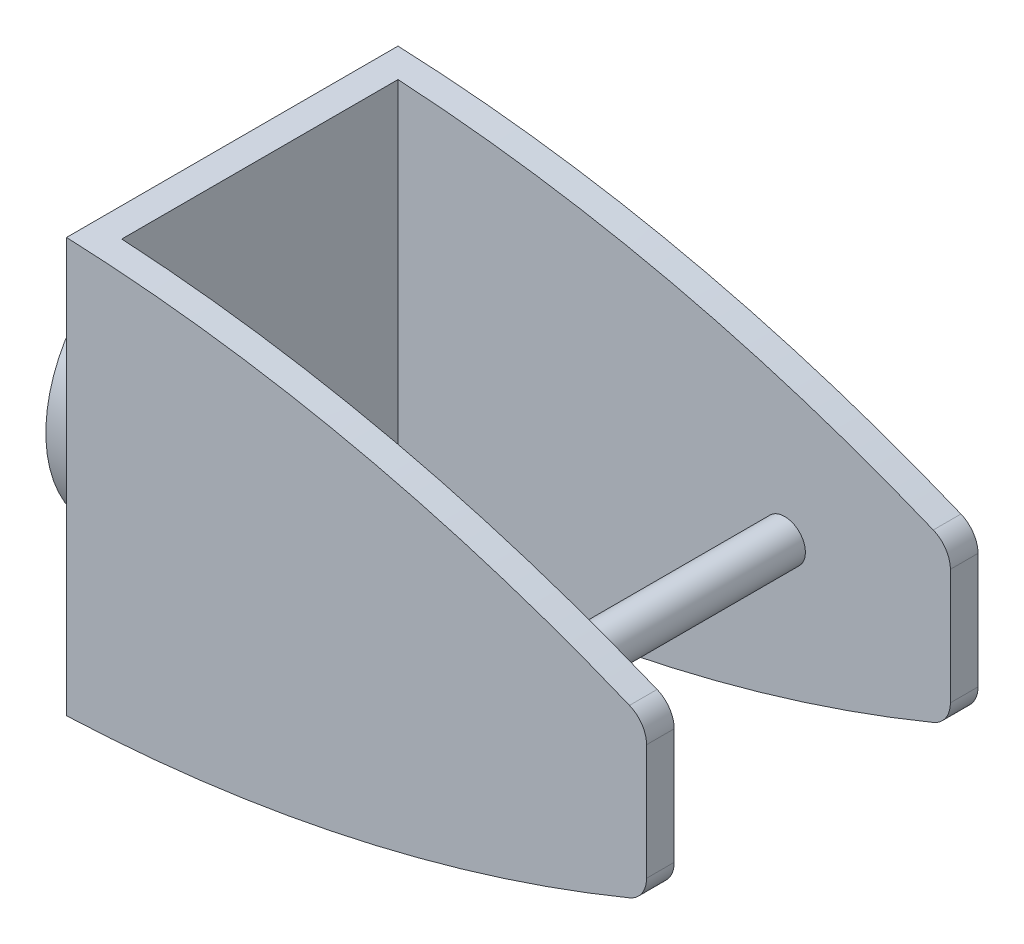
ISO-10303-21;
HEADER;
FILE_DESCRIPTION(('STEP AP214'),'2;1');
FILE_NAME('part.step','',(''),(''),'','','');
FILE_SCHEMA(('AUTOMOTIVE_DESIGN { 1 0 10303 214 1 1 1 1 }'));
ENDSEC;
DATA;
#1=APPLICATION_CONTEXT('core data for automotive mechanical design processes');
#2=APPLICATION_PROTOCOL_DEFINITION('international standard','automotive_design',2000,#1);
#3=PRODUCT_CONTEXT('',#1,'mechanical');
#4=PRODUCT('Part','Part','',(#3));
#5=PRODUCT_RELATED_PRODUCT_CATEGORY('part','',(#4));
#6=PRODUCT_DEFINITION_FORMATION('','',#4);
#7=PRODUCT_DEFINITION_CONTEXT('part definition',#1,'design');
#8=PRODUCT_DEFINITION('design','',#6,#7);
#9=PRODUCT_DEFINITION_SHAPE('','',#8);
#10=(LENGTH_UNIT() NAMED_UNIT(*) SI_UNIT(.MILLI.,.METRE.));
#11=(NAMED_UNIT(*) PLANE_ANGLE_UNIT() SI_UNIT($,.RADIAN.));
#12=(NAMED_UNIT(*) SI_UNIT($,.STERADIAN.) SOLID_ANGLE_UNIT());
#13=UNCERTAINTY_MEASURE_WITH_UNIT(LENGTH_MEASURE(1.E-05),#10,'distance_accuracy_value','');
#14=(GEOMETRIC_REPRESENTATION_CONTEXT(3) GLOBAL_UNCERTAINTY_ASSIGNED_CONTEXT((#13)) GLOBAL_UNIT_ASSIGNED_CONTEXT((#10,
#11,#12)) REPRESENTATION_CONTEXT('',''));
#15=CARTESIAN_POINT('',(0.,0.,0.));
#16=DIRECTION('',(0.,0.,1.));
#17=DIRECTION('',(1.,0.,0.));
#18=AXIS2_PLACEMENT_3D('',#15,#16,#17);
#19=CARTESIAN_POINT('',(5.5,0.,0.));
#20=DIRECTION('',(1.,0.,0.));
#21=DIRECTION('',(0.,0.,-1.));
#22=AXIS2_PLACEMENT_3D('',#19,#20,#21);
#23=PLANE('',#22);
#24=DIRECTION('',(0.,0.,1.));
#25=VECTOR('',#24,1.);
#26=CARTESIAN_POINT('',(5.5,14.8998712709332,-28.));
#27=LINE('',#26,#25);
#28=CARTESIAN_POINT('',(5.5,14.8998712709332,10.));
#29=VERTEX_POINT('',#28);
#30=CARTESIAN_POINT('',(5.5,14.8998712709332,-10.));
#31=VERTEX_POINT('',#30);
#32=EDGE_CURVE('E209',#29,#31,#27,.F.);
#33=ORIENTED_EDGE('',*,*,#32,.F.);
#34=DIRECTION('',(0.,1.,0.));
#35=VECTOR('',#34,1.);
#36=CARTESIAN_POINT('',(5.5,15.,10.));
#37=LINE('',#36,#35);
#38=CARTESIAN_POINT('',(5.5,-14.8998712709332,10.));
#39=VERTEX_POINT('',#38);
#40=EDGE_CURVE('E208',#39,#29,#37,.T.);
#41=ORIENTED_EDGE('',*,*,#40,.F.);
#42=DIRECTION('',(0.,0.,1.));
#43=VECTOR('',#42,1.);
#44=CARTESIAN_POINT('',(5.5,-14.8998712709332,-28.));
#45=LINE('',#44,#43);
#46=CARTESIAN_POINT('',(5.5,-14.8998712709332,-10.));
#47=VERTEX_POINT('',#46);
#48=EDGE_CURVE('E236',#47,#39,#45,.T.);
#49=ORIENTED_EDGE('',*,*,#48,.F.);
#50=DIRECTION('',(0.,-1.,0.));
#51=VECTOR('',#50,1.);
#52=CARTESIAN_POINT('',(5.5,15.,-10.));
#53=LINE('',#52,#51);
#54=EDGE_CURVE('E160',#31,#47,#53,.T.);
#55=ORIENTED_EDGE('',*,*,#54,.F.);
#56=EDGE_LOOP('',(#33,#41,#49,#55));
#57=FACE_BOUND('',#56,.T.);
#58=ADVANCED_FACE('F35',(#57),#23,.T.);
#59=CARTESIAN_POINT('',(3.5,0.,0.));
#60=DIRECTION('',(-1.,0.,0.));
#61=DIRECTION('',(0.,0.,1.));
#62=AXIS2_PLACEMENT_3D('',#59,#60,#61);
#63=CYLINDRICAL_SURFACE('',#62,10.);
#64=CARTESIAN_POINT('',(3.5,0.,0.));
#65=DIRECTION('',(1.,0.,0.));
#66=DIRECTION('',(0.,0.,-1.));
#67=AXIS2_PLACEMENT_3D('',#64,#65,#66);
#68=CIRCLE('',#67,10.);
#69=CARTESIAN_POINT('',(3.5,0.,-10.));
#70=VERTEX_POINT('',#69);
#71=EDGE_CURVE('E163',#70,#70,#68,.T.);
#72=ORIENTED_EDGE('',*,*,#71,.F.);
#73=EDGE_LOOP('',(#72));
#74=FACE_BOUND('',#73,.T.);
#75=CARTESIAN_POINT('',(0.,0.,0.));
#76=DIRECTION('',(1.,0.,0.));
#77=DIRECTION('',(0.,0.,-1.));
#78=AXIS2_PLACEMENT_3D('',#75,#76,#77);
#79=CIRCLE('',#78,10.);
#80=CARTESIAN_POINT('',(0.,0.,-10.));
#81=VERTEX_POINT('',#80);
#82=EDGE_CURVE('E135',#81,#81,#79,.T.);
#83=ORIENTED_EDGE('',*,*,#82,.T.);
#84=EDGE_LOOP('',(#83));
#85=FACE_BOUND('',#84,.T.);
#86=ADVANCED_FACE('F261',(#74,#85),#63,.T.);
#87=CARTESIAN_POINT('',(0.,0.,0.));
#88=DIRECTION('',(1.,0.,0.));
#89=DIRECTION('',(0.,0.,-1.));
#90=AXIS2_PLACEMENT_3D('',#87,#88,#89);
#91=PLANE('',#90);
#92=ORIENTED_EDGE('',*,*,#82,.F.);
#93=EDGE_LOOP('',(#92));
#94=FACE_BOUND('',#93,.T.);
#95=ADVANCED_FACE('F266',(#94),#91,.F.);
#96=CARTESIAN_POINT('',(5.5,15.,12.));
#97=DIRECTION('',(0.,0.,-1.));
#98=DIRECTION('',(0.,1.,0.));
#99=AXIS2_PLACEMENT_3D('',#96,#97,#98);
#100=PLANE('',#99);
#101=CARTESIAN_POINT('',(-1.5,104.895788082818,12.));
#102=DIRECTION('',(0.,0.,-1.));
#103=DIRECTION('',(1.,0.,0.));
#104=AXIS2_PLACEMENT_3D('',#101,#102,#103);
#105=CIRCLE('',#104,120.);
#106=CARTESIAN_POINT('',(44.2627118644068,-6.03560604353059,12.));
#107=VERTEX_POINT('',#106);
#108=CARTESIAN_POINT('',(3.5,-15.,12.));
#109=VERTEX_POINT('',#108);
#110=EDGE_CURVE('E147',#107,#109,#105,.T.);
#111=ORIENTED_EDGE('',*,*,#110,.F.);
#112=CARTESIAN_POINT('',(43.5,-4.18674947475813,12.));
#113=DIRECTION('',(0.,0.,-1.));
#114=DIRECTION('',(0.,1.,0.));
#115=AXIS2_PLACEMENT_3D('',#112,#113,#114);
#116=CIRCLE('',#115,2.);
#117=CARTESIAN_POINT('',(45.5,-4.18674947475813,12.));
#118=VERTEX_POINT('',#117);
#119=EDGE_CURVE('E175',#107,#118,#116,.F.);
#120=ORIENTED_EDGE('',*,*,#119,.T.);
#121=DIRECTION('',(0.,-1.,0.));
#122=VECTOR('',#121,1.);
#123=CARTESIAN_POINT('',(45.5,15.,12.));
#124=LINE('',#123,#122);
#125=CARTESIAN_POINT('',(45.5,4.18674947475813,12.));
#126=VERTEX_POINT('',#125);
#127=EDGE_CURVE('E220',#126,#118,#124,.T.);
#128=ORIENTED_EDGE('',*,*,#127,.F.);
#129=CARTESIAN_POINT('',(43.5,4.18674947475813,12.));
#130=DIRECTION('',(0.,0.,-1.));
#131=DIRECTION('',(0.,1.,0.));
#132=AXIS2_PLACEMENT_3D('',#129,#130,#131);
#133=CIRCLE('',#132,2.);
#134=CARTESIAN_POINT('',(44.2627118644068,6.03560604353059,12.));
#135=VERTEX_POINT('',#134);
#136=EDGE_CURVE('E145',#126,#135,#133,.F.);
#137=ORIENTED_EDGE('',*,*,#136,.T.);
#138=CARTESIAN_POINT('',(-1.5,-104.895788082818,12.));
#139=DIRECTION('',(0.,0.,-1.));
#140=DIRECTION('',(-1.,0.,0.));
#141=AXIS2_PLACEMENT_3D('',#138,#139,#140);
#142=CIRCLE('',#141,120.);
#143=CARTESIAN_POINT('',(3.5,15.,12.));
#144=VERTEX_POINT('',#143);
#145=EDGE_CURVE('E128',#144,#135,#142,.T.);
#146=ORIENTED_EDGE('',*,*,#145,.F.);
#147=DIRECTION('',(0.,-1.,0.));
#148=VECTOR('',#147,1.);
#149=CARTESIAN_POINT('',(3.5,15.,12.));
#150=LINE('',#149,#148);
#151=EDGE_CURVE('E142',#144,#109,#150,.T.);
#152=ORIENTED_EDGE('',*,*,#151,.T.);
#153=EDGE_LOOP('',(#111,#120,#128,#137,#146,#152));
#154=FACE_BOUND('',#153,.T.);
#155=ADVANCED_FACE('F141',(#154),#100,.F.);
#156=CARTESIAN_POINT('',(5.5,15.,-12.));
#157=DIRECTION('',(0.,0.,1.));
#158=DIRECTION('',(0.,-1.,0.));
#159=AXIS2_PLACEMENT_3D('',#156,#157,#158);
#160=PLANE('',#159);
#161=DIRECTION('',(0.,1.,0.));
#162=VECTOR('',#161,1.);
#163=CARTESIAN_POINT('',(45.5,15.,-12.));
#164=LINE('',#163,#162);
#165=CARTESIAN_POINT('',(45.5,-4.18674947475813,-12.));
#166=VERTEX_POINT('',#165);
#167=CARTESIAN_POINT('',(45.5,4.18674947475813,-12.));
#168=VERTEX_POINT('',#167);
#169=EDGE_CURVE('E157',#166,#168,#164,.T.);
#170=ORIENTED_EDGE('',*,*,#169,.F.);
#171=CARTESIAN_POINT('',(43.5,-4.18674947475813,-12.));
#172=DIRECTION('',(0.,0.,1.));
#173=DIRECTION('',(0.,-1.,0.));
#174=AXIS2_PLACEMENT_3D('',#171,#172,#173);
#175=CIRCLE('',#174,2.);
#176=CARTESIAN_POINT('',(44.2627118644068,-6.03560604353059,-12.));
#177=VERTEX_POINT('',#176);
#178=EDGE_CURVE('E195',#166,#177,#175,.F.);
#179=ORIENTED_EDGE('',*,*,#178,.T.);
#180=CARTESIAN_POINT('',(-1.5,104.895788082818,-12.));
#181=DIRECTION('',(0.,0.,1.));
#182=DIRECTION('',(0.,-1.,0.));
#183=AXIS2_PLACEMENT_3D('',#180,#181,#182);
#184=CIRCLE('',#183,120.);
#185=CARTESIAN_POINT('',(3.5,-15.,-12.));
#186=VERTEX_POINT('',#185);
#187=EDGE_CURVE('E210',#177,#186,#184,.F.);
#188=ORIENTED_EDGE('',*,*,#187,.T.);
#189=DIRECTION('',(0.,1.,0.));
#190=VECTOR('',#189,1.);
#191=CARTESIAN_POINT('',(3.5,15.,-12.));
#192=LINE('',#191,#190);
#193=CARTESIAN_POINT('',(3.5,15.,-12.));
#194=VERTEX_POINT('',#193);
#195=EDGE_CURVE('E136',#186,#194,#192,.T.);
#196=ORIENTED_EDGE('',*,*,#195,.T.);
#197=CARTESIAN_POINT('',(-1.5,-104.895788082818,-12.));
#198=DIRECTION('',(0.,0.,1.));
#199=DIRECTION('',(0.,-1.,0.));
#200=AXIS2_PLACEMENT_3D('',#197,#198,#199);
#201=CIRCLE('',#200,120.);
#202=CARTESIAN_POINT('',(44.2627118644068,6.03560604353059,-12.));
#203=VERTEX_POINT('',#202);
#204=EDGE_CURVE('E130',#194,#203,#201,.F.);
#205=ORIENTED_EDGE('',*,*,#204,.T.);
#206=CARTESIAN_POINT('',(43.5,4.18674947475813,-12.));
#207=DIRECTION('',(0.,0.,1.));
#208=DIRECTION('',(0.,-1.,0.));
#209=AXIS2_PLACEMENT_3D('',#206,#207,#208);
#210=CIRCLE('',#209,2.);
#211=EDGE_CURVE('E56',#203,#168,#210,.F.);
#212=ORIENTED_EDGE('',*,*,#211,.T.);
#213=EDGE_LOOP('',(#170,#179,#188,#196,#205,#212));
#214=FACE_BOUND('',#213,.T.);
#215=ADVANCED_FACE('F274',(#214),#160,.F.);
#216=CARTESIAN_POINT('',(3.5,0.,0.));
#217=DIRECTION('',(1.,0.,0.));
#218=DIRECTION('',(0.,0.,-1.));
#219=AXIS2_PLACEMENT_3D('',#216,#217,#218);
#220=PLANE('',#219);
#221=ORIENTED_EDGE('',*,*,#71,.T.);
#222=EDGE_LOOP('',(#221));
#223=FACE_BOUND('',#222,.T.);
#224=ORIENTED_EDGE('',*,*,#151,.F.);
#225=DIRECTION('',(0.,0.,1.));
#226=VECTOR('',#225,1.);
#227=CARTESIAN_POINT('',(3.5,15.,12.));
#228=LINE('',#227,#226);
#229=EDGE_CURVE('E124',#194,#144,#228,.T.);
#230=ORIENTED_EDGE('',*,*,#229,.F.);
#231=ORIENTED_EDGE('',*,*,#195,.F.);
#232=DIRECTION('',(0.,0.,-1.));
#233=VECTOR('',#232,1.);
#234=CARTESIAN_POINT('',(3.5,-15.,12.));
#235=LINE('',#234,#233);
#236=EDGE_CURVE('E152',#109,#186,#235,.T.);
#237=ORIENTED_EDGE('',*,*,#236,.F.);
#238=EDGE_LOOP('',(#224,#230,#231,#237));
#239=FACE_BOUND('',#238,.T.);
#240=ADVANCED_FACE('F150',(#223,#239),#220,.F.);
#241=CARTESIAN_POINT('',(45.5,15.,-10.));
#242=DIRECTION('',(0.,0.,-1.));
#243=DIRECTION('',(0.,1.,0.));
#244=AXIS2_PLACEMENT_3D('',#241,#242,#243);
#245=PLANE('',#244);
#246=CARTESIAN_POINT('',(33.5,0.,-10.));
#247=DIRECTION('',(0.,0.,-1.));
#248=DIRECTION('',(0.,1.,0.));
#249=AXIS2_PLACEMENT_3D('',#246,#247,#248);
#250=CIRCLE('',#249,1.5);
#251=CARTESIAN_POINT('',(33.5,1.5,-10.));
#252=VERTEX_POINT('',#251);
#253=EDGE_CURVE('E242',#252,#252,#250,.T.);
#254=ORIENTED_EDGE('',*,*,#253,.T.);
#255=EDGE_LOOP('',(#254));
#256=FACE_BOUND('',#255,.T.);
#257=CARTESIAN_POINT('',(-1.5,104.895788082818,-9.99999999999999));
#258=DIRECTION('',(0.,0.,-1.));
#259=DIRECTION('',(0.,1.,0.));
#260=AXIS2_PLACEMENT_3D('',#257,#258,#259);
#261=CIRCLE('',#260,120.);
#262=CARTESIAN_POINT('',(44.2627118644068,-6.03560604353059,-10.));
#263=VERTEX_POINT('',#262);
#264=EDGE_CURVE('E214',#47,#263,#261,.F.);
#265=ORIENTED_EDGE('',*,*,#264,.T.);
#266=CARTESIAN_POINT('',(43.5,-4.18674947475813,-10.));
#267=DIRECTION('',(0.,0.,-1.));
#268=DIRECTION('',(0.,1.,0.));
#269=AXIS2_PLACEMENT_3D('',#266,#267,#268);
#270=CIRCLE('',#269,2.);
#271=CARTESIAN_POINT('',(45.5,-4.18674947475813,-10.));
#272=VERTEX_POINT('',#271);
#273=EDGE_CURVE('E187',#263,#272,#270,.F.);
#274=ORIENTED_EDGE('',*,*,#273,.T.);
#275=DIRECTION('',(0.,-1.,0.));
#276=VECTOR('',#275,1.);
#277=CARTESIAN_POINT('',(45.5,15.,-10.));
#278=LINE('',#277,#276);
#279=CARTESIAN_POINT('',(45.5,4.18674947475813,-10.));
#280=VERTEX_POINT('',#279);
#281=EDGE_CURVE('E153',#280,#272,#278,.T.);
#282=ORIENTED_EDGE('',*,*,#281,.F.);
#283=CARTESIAN_POINT('',(43.5,4.18674947475813,-10.));
#284=DIRECTION('',(0.,0.,-1.));
#285=DIRECTION('',(0.,1.,0.));
#286=AXIS2_PLACEMENT_3D('',#283,#284,#285);
#287=CIRCLE('',#286,2.);
#288=CARTESIAN_POINT('',(44.2627118644068,6.03560604353059,-10.));
#289=VERTEX_POINT('',#288);
#290=EDGE_CURVE('E185',#280,#289,#287,.F.);
#291=ORIENTED_EDGE('',*,*,#290,.T.);
#292=CARTESIAN_POINT('',(-1.5,-104.895788082818,-10.));
#293=DIRECTION('',(0.,0.,-1.));
#294=DIRECTION('',(0.,1.,0.));
#295=AXIS2_PLACEMENT_3D('',#292,#293,#294);
#296=CIRCLE('',#295,120.);
#297=EDGE_CURVE('E212',#289,#31,#296,.F.);
#298=ORIENTED_EDGE('',*,*,#297,.T.);
#299=ORIENTED_EDGE('',*,*,#54,.T.);
#300=EDGE_LOOP('',(#265,#274,#282,#291,#298,#299));
#301=FACE_BOUND('',#300,.T.);
#302=ADVANCED_FACE('F232',(#256,#301),#245,.F.);
#303=CARTESIAN_POINT('',(45.5,0.,0.));
#304=DIRECTION('',(-1.,0.,0.));
#305=DIRECTION('',(0.,0.,1.));
#306=AXIS2_PLACEMENT_3D('',#303,#304,#305);
#307=PLANE('',#306);
#308=ORIENTED_EDGE('',*,*,#281,.T.);
#309=DIRECTION('',(0.,0.,1.));
#310=VECTOR('',#309,1.);
#311=CARTESIAN_POINT('',(45.5,-4.18674947475813,0.));
#312=LINE('',#311,#310);
#313=EDGE_CURVE('E192',#272,#166,#312,.F.);
#314=ORIENTED_EDGE('',*,*,#313,.T.);
#315=ORIENTED_EDGE('',*,*,#169,.T.);
#316=DIRECTION('',(0.,0.,1.));
#317=VECTOR('',#316,1.);
#318=CARTESIAN_POINT('',(45.5,4.18674947475813,0.));
#319=LINE('',#318,#317);
#320=EDGE_CURVE('E189',#168,#280,#319,.T.);
#321=ORIENTED_EDGE('',*,*,#320,.T.);
#322=EDGE_LOOP('',(#308,#314,#315,#321));
#323=FACE_BOUND('',#322,.T.);
#324=ADVANCED_FACE('F295',(#323),#307,.F.);
#325=CARTESIAN_POINT('',(45.5,15.,10.));
#326=DIRECTION('',(0.,0.,1.));
#327=DIRECTION('',(0.,-1.,0.));
#328=AXIS2_PLACEMENT_3D('',#325,#326,#327);
#329=PLANE('',#328);
#330=CARTESIAN_POINT('',(33.5,0.,10.));
#331=DIRECTION('',(0.,0.,1.));
#332=DIRECTION('',(0.,-1.,0.));
#333=AXIS2_PLACEMENT_3D('',#330,#331,#332);
#334=CIRCLE('',#333,1.5);
#335=CARTESIAN_POINT('',(33.5,-1.50000000000001,10.));
#336=VERTEX_POINT('',#335);
#337=EDGE_CURVE('E39',#336,#336,#334,.T.);
#338=ORIENTED_EDGE('',*,*,#337,.T.);
#339=EDGE_LOOP('',(#338));
#340=FACE_BOUND('',#339,.T.);
#341=DIRECTION('',(0.,1.,0.));
#342=VECTOR('',#341,1.);
#343=CARTESIAN_POINT('',(45.5,15.,10.));
#344=LINE('',#343,#342);
#345=CARTESIAN_POINT('',(45.5,-4.18674947475813,10.));
#346=VERTEX_POINT('',#345);
#347=CARTESIAN_POINT('',(45.5,4.18674947475813,10.));
#348=VERTEX_POINT('',#347);
#349=EDGE_CURVE('E223',#346,#348,#344,.T.);
#350=ORIENTED_EDGE('',*,*,#349,.F.);
#351=CARTESIAN_POINT('',(43.5,-4.18674947475813,10.));
#352=DIRECTION('',(0.,0.,1.));
#353=DIRECTION('',(0.,-1.,0.));
#354=AXIS2_PLACEMENT_3D('',#351,#352,#353);
#355=CIRCLE('',#354,2.);
#356=CARTESIAN_POINT('',(44.2627118644068,-6.03560604353059,10.));
#357=VERTEX_POINT('',#356);
#358=EDGE_CURVE('E183',#346,#357,#355,.F.);
#359=ORIENTED_EDGE('',*,*,#358,.T.);
#360=CARTESIAN_POINT('',(-1.5,104.895788082818,10.));
#361=DIRECTION('',(0.,0.,1.));
#362=DIRECTION('',(0.,-1.,0.));
#363=AXIS2_PLACEMENT_3D('',#360,#361,#362);
#364=CIRCLE('',#363,120.);
#365=EDGE_CURVE('E146',#357,#39,#364,.F.);
#366=ORIENTED_EDGE('',*,*,#365,.T.);
#367=ORIENTED_EDGE('',*,*,#40,.T.);
#368=CARTESIAN_POINT('',(-1.5,-104.895788082818,9.99999999999999));
#369=DIRECTION('',(0.,0.,1.));
#370=DIRECTION('',(0.,-1.,0.));
#371=AXIS2_PLACEMENT_3D('',#368,#369,#370);
#372=CIRCLE('',#371,120.);
#373=CARTESIAN_POINT('',(44.2627118644068,6.03560604353059,10.));
#374=VERTEX_POINT('',#373);
#375=EDGE_CURVE('E199',#29,#374,#372,.F.);
#376=ORIENTED_EDGE('',*,*,#375,.T.);
#377=CARTESIAN_POINT('',(43.5,4.18674947475813,10.));
#378=DIRECTION('',(0.,0.,1.));
#379=DIRECTION('',(0.,-1.,0.));
#380=AXIS2_PLACEMENT_3D('',#377,#378,#379);
#381=CIRCLE('',#380,2.);
#382=EDGE_CURVE('E181',#374,#348,#381,.F.);
#383=ORIENTED_EDGE('',*,*,#382,.T.);
#384=EDGE_LOOP('',(#350,#359,#366,#367,#376,#383));
#385=FACE_BOUND('',#384,.T.);
#386=ADVANCED_FACE('F205',(#340,#385),#329,.F.);
#387=CARTESIAN_POINT('',(45.5,0.,0.));
#388=DIRECTION('',(1.,0.,0.));
#389=DIRECTION('',(0.,0.,-1.));
#390=AXIS2_PLACEMENT_3D('',#387,#388,#389);
#391=PLANE('',#390);
#392=ORIENTED_EDGE('',*,*,#127,.T.);
#393=DIRECTION('',(0.,0.,-1.));
#394=VECTOR('',#393,1.);
#395=CARTESIAN_POINT('',(45.5,-4.18674947475813,10.));
#396=LINE('',#395,#394);
#397=EDGE_CURVE('E179',#118,#346,#396,.T.);
#398=ORIENTED_EDGE('',*,*,#397,.T.);
#399=ORIENTED_EDGE('',*,*,#349,.T.);
#400=DIRECTION('',(0.,0.,-1.));
#401=VECTOR('',#400,1.);
#402=CARTESIAN_POINT('',(45.5,4.18674947475813,12.));
#403=LINE('',#402,#401);
#404=EDGE_CURVE('E177',#348,#126,#403,.F.);
#405=ORIENTED_EDGE('',*,*,#404,.T.);
#406=EDGE_LOOP('',(#392,#398,#399,#405));
#407=FACE_BOUND('',#406,.T.);
#408=ADVANCED_FACE('F304',(#407),#391,.T.);
#409=CARTESIAN_POINT('',(-1.5,104.895788082818,-28.));
#410=DIRECTION('',(0.,0.,1.));
#411=DIRECTION('',(1.,0.,0.));
#412=AXIS2_PLACEMENT_3D('',#409,#410,#411);
#413=CYLINDRICAL_SURFACE('',#412,120.);
#414=ORIENTED_EDGE('',*,*,#365,.F.);
#415=DIRECTION('',(0.,0.,1.));
#416=VECTOR('',#415,1.);
#417=CARTESIAN_POINT('',(44.2627118644068,-6.03560604353059,-28.));
#418=LINE('',#417,#416);
#419=EDGE_CURVE('E171',#357,#107,#418,.T.);
#420=ORIENTED_EDGE('',*,*,#419,.T.);
#421=ORIENTED_EDGE('',*,*,#110,.T.);
#422=ORIENTED_EDGE('',*,*,#236,.T.);
#423=ORIENTED_EDGE('',*,*,#187,.F.);
#424=DIRECTION('',(0.,0.,1.));
#425=VECTOR('',#424,1.);
#426=CARTESIAN_POINT('',(44.2627118644068,-6.03560604353059,-28.));
#427=LINE('',#426,#425);
#428=EDGE_CURVE('E166',#177,#263,#427,.T.);
#429=ORIENTED_EDGE('',*,*,#428,.T.);
#430=ORIENTED_EDGE('',*,*,#264,.F.);
#431=ORIENTED_EDGE('',*,*,#48,.T.);
#432=EDGE_LOOP('',(#414,#420,#421,#422,#423,#429,#430,#431));
#433=FACE_BOUND('',#432,.T.);
#434=ADVANCED_FACE('F300',(#433),#413,.T.);
#435=CARTESIAN_POINT('',(-1.5,-104.895788082818,-28.));
#436=DIRECTION('',(0.,0.,1.));
#437=DIRECTION('',(1.,0.,0.));
#438=AXIS2_PLACEMENT_3D('',#435,#436,#437);
#439=CYLINDRICAL_SURFACE('',#438,120.);
#440=ORIENTED_EDGE('',*,*,#297,.F.);
#441=DIRECTION('',(0.,0.,1.));
#442=VECTOR('',#441,1.);
#443=CARTESIAN_POINT('',(44.2627118644068,6.03560604353059,-28.));
#444=LINE('',#443,#442);
#445=EDGE_CURVE('E11',#289,#203,#444,.F.);
#446=ORIENTED_EDGE('',*,*,#445,.T.);
#447=ORIENTED_EDGE('',*,*,#204,.F.);
#448=ORIENTED_EDGE('',*,*,#229,.T.);
#449=ORIENTED_EDGE('',*,*,#145,.T.);
#450=DIRECTION('',(0.,0.,1.));
#451=VECTOR('',#450,1.);
#452=CARTESIAN_POINT('',(44.2627118644068,6.03560604353059,-28.));
#453=LINE('',#452,#451);
#454=EDGE_CURVE('E44',#135,#374,#453,.F.);
#455=ORIENTED_EDGE('',*,*,#454,.T.);
#456=ORIENTED_EDGE('',*,*,#375,.F.);
#457=ORIENTED_EDGE('',*,*,#32,.T.);
#458=EDGE_LOOP('',(#440,#446,#447,#448,#449,#455,#456,#457));
#459=FACE_BOUND('',#458,.T.);
#460=ADVANCED_FACE('F126',(#459),#439,.T.);
#461=CARTESIAN_POINT('',(43.5,-4.18674947475813,-28.));
#462=DIRECTION('',(0.,0.,1.));
#463=DIRECTION('',(1.,0.,0.));
#464=AXIS2_PLACEMENT_3D('',#461,#462,#463);
#465=CYLINDRICAL_SURFACE('',#464,2.);
#466=ORIENTED_EDGE('',*,*,#358,.F.);
#467=ORIENTED_EDGE('',*,*,#397,.F.);
#468=ORIENTED_EDGE('',*,*,#119,.F.);
#469=ORIENTED_EDGE('',*,*,#419,.F.);
#470=EDGE_LOOP('',(#466,#467,#468,#469));
#471=FACE_BOUND('',#470,.T.);
#472=ADVANCED_FACE('F283',(#471),#465,.T.);
#473=CARTESIAN_POINT('',(43.5,-4.18674947475813,-28.));
#474=DIRECTION('',(0.,0.,1.));
#475=DIRECTION('',(1.,0.,0.));
#476=AXIS2_PLACEMENT_3D('',#473,#474,#475);
#477=CYLINDRICAL_SURFACE('',#476,2.);
#478=ORIENTED_EDGE('',*,*,#178,.F.);
#479=ORIENTED_EDGE('',*,*,#313,.F.);
#480=ORIENTED_EDGE('',*,*,#273,.F.);
#481=ORIENTED_EDGE('',*,*,#428,.F.);
#482=EDGE_LOOP('',(#478,#479,#480,#481));
#483=FACE_BOUND('',#482,.T.);
#484=ADVANCED_FACE('F286',(#483),#477,.T.);
#485=CARTESIAN_POINT('',(43.5,4.18674947475813,-28.));
#486=DIRECTION('',(0.,0.,1.));
#487=DIRECTION('',(1.,0.,0.));
#488=AXIS2_PLACEMENT_3D('',#485,#486,#487);
#489=CYLINDRICAL_SURFACE('',#488,2.);
#490=ORIENTED_EDGE('',*,*,#211,.F.);
#491=ORIENTED_EDGE('',*,*,#445,.F.);
#492=ORIENTED_EDGE('',*,*,#290,.F.);
#493=ORIENTED_EDGE('',*,*,#320,.F.);
#494=EDGE_LOOP('',(#490,#491,#492,#493));
#495=FACE_BOUND('',#494,.T.);
#496=ADVANCED_FACE('F258',(#495),#489,.T.);
#497=CARTESIAN_POINT('',(43.5,4.18674947475813,-28.));
#498=DIRECTION('',(0.,0.,1.));
#499=DIRECTION('',(1.,0.,0.));
#500=AXIS2_PLACEMENT_3D('',#497,#498,#499);
#501=CYLINDRICAL_SURFACE('',#500,2.);
#502=ORIENTED_EDGE('',*,*,#136,.F.);
#503=ORIENTED_EDGE('',*,*,#404,.F.);
#504=ORIENTED_EDGE('',*,*,#382,.F.);
#505=ORIENTED_EDGE('',*,*,#454,.F.);
#506=EDGE_LOOP('',(#502,#503,#504,#505));
#507=FACE_BOUND('',#506,.T.);
#508=ADVANCED_FACE('F37',(#507),#501,.T.);
#509=CARTESIAN_POINT('',(33.5,0.,-16.2426406871193));
#510=DIRECTION('',(0.,0.,1.));
#511=DIRECTION('',(1.,0.,0.));
#512=AXIS2_PLACEMENT_3D('',#509,#510,#511);
#513=CYLINDRICAL_SURFACE('',#512,1.5);
#514=ORIENTED_EDGE('',*,*,#337,.F.);
#515=EDGE_LOOP('',(#514));
#516=FACE_BOUND('',#515,.T.);
#517=ORIENTED_EDGE('',*,*,#253,.F.);
#518=EDGE_LOOP('',(#517));
#519=FACE_BOUND('',#518,.T.);
#520=ADVANCED_FACE('F251',(#516,#519),#513,.T.);
#521=CLOSED_SHELL('',(#58,#86,#95,#155,#215,#240,#302,#324,#386,#408,#434,#460,#472,#484,#496,
#508,#520));
#522=MANIFOLD_SOLID_BREP('B2',#521);
#523=ADVANCED_BREP_SHAPE_REPRESENTATION('',(#18,#522),#14);
#524=SHAPE_DEFINITION_REPRESENTATION(#9,#523);
ENDSEC;
END-ISO-10303-21;
